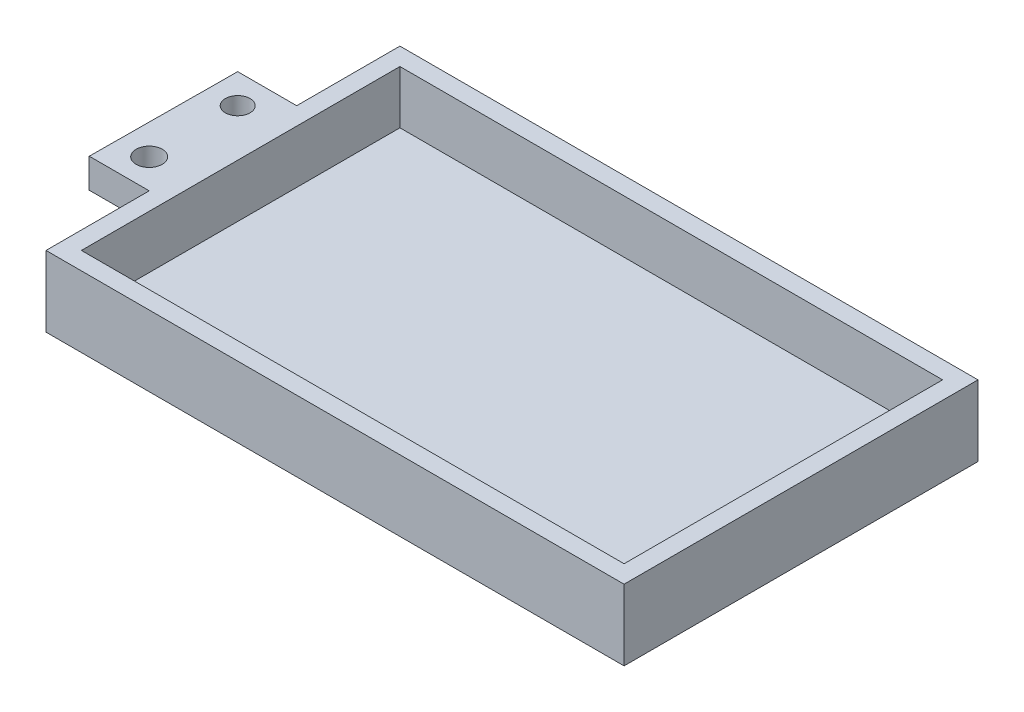
ISO-10303-21;
HEADER;
FILE_DESCRIPTION(('STEP AP214'),'2;1');
FILE_NAME('part.step','',(''),(''),'','','');
FILE_SCHEMA(('AUTOMOTIVE_DESIGN { 1 0 10303 214 1 1 1 1 }'));
ENDSEC;
DATA;
#1=APPLICATION_CONTEXT('core data for automotive mechanical design processes');
#2=APPLICATION_PROTOCOL_DEFINITION('international standard','automotive_design',2000,#1);
#3=PRODUCT_CONTEXT('',#1,'mechanical');
#4=PRODUCT('Part','Part','',(#3));
#5=PRODUCT_RELATED_PRODUCT_CATEGORY('part','',(#4));
#6=PRODUCT_DEFINITION_FORMATION('','',#4);
#7=PRODUCT_DEFINITION_CONTEXT('part definition',#1,'design');
#8=PRODUCT_DEFINITION('design','',#6,#7);
#9=PRODUCT_DEFINITION_SHAPE('','',#8);
#10=(LENGTH_UNIT() NAMED_UNIT(*) SI_UNIT(.MILLI.,.METRE.));
#11=(NAMED_UNIT(*) PLANE_ANGLE_UNIT() SI_UNIT($,.RADIAN.));
#12=(NAMED_UNIT(*) SI_UNIT($,.STERADIAN.) SOLID_ANGLE_UNIT());
#13=UNCERTAINTY_MEASURE_WITH_UNIT(LENGTH_MEASURE(1.E-05),#10,'distance_accuracy_value','');
#14=(GEOMETRIC_REPRESENTATION_CONTEXT(3) GLOBAL_UNCERTAINTY_ASSIGNED_CONTEXT((#13)) GLOBAL_UNIT_ASSIGNED_CONTEXT((#10,
#11,#12)) REPRESENTATION_CONTEXT('',''));
#15=CARTESIAN_POINT('',(0.,0.,0.));
#16=DIRECTION('',(0.,0.,1.));
#17=DIRECTION('',(1.,0.,0.));
#18=AXIS2_PLACEMENT_3D('',#15,#16,#17);
#19=CARTESIAN_POINT('',(-59.,12.,-12.5));
#20=DIRECTION('',(0.,0.,1.));
#21=DIRECTION('',(1.,0.,0.));
#22=AXIS2_PLACEMENT_3D('',#19,#20,#21);
#23=PLANE('',#22);
#24=DIRECTION('',(1.,0.,0.));
#25=VECTOR('',#24,1.);
#26=CARTESIAN_POINT('',(-59.1680789894156,7.,-12.5));
#27=LINE('',#26,#25);
#28=CARTESIAN_POINT('',(-59.,7.,-12.5));
#29=VERTEX_POINT('',#28);
#30=CARTESIAN_POINT('',(-49.,7.,-12.5));
#31=VERTEX_POINT('',#30);
#32=EDGE_CURVE('E173',#29,#31,#27,.T.);
#33=ORIENTED_EDGE('',*,*,#32,.F.);
#34=DIRECTION('',(0.,-1.,0.));
#35=VECTOR('',#34,1.);
#36=CARTESIAN_POINT('',(-59.,12.,-12.5));
#37=LINE('',#36,#35);
#38=CARTESIAN_POINT('',(-59.,12.,-12.5));
#39=VERTEX_POINT('',#38);
#40=EDGE_CURVE('E295',#39,#29,#37,.T.);
#41=ORIENTED_EDGE('',*,*,#40,.F.);
#42=DIRECTION('',(-1.,0.,0.));
#43=VECTOR('',#42,1.);
#44=CARTESIAN_POINT('',(-59.,12.,-12.5));
#45=LINE('',#44,#43);
#46=CARTESIAN_POINT('',(-49.,12.,-12.5));
#47=VERTEX_POINT('',#46);
#48=EDGE_CURVE('E253',#47,#39,#45,.T.);
#49=ORIENTED_EDGE('',*,*,#48,.F.);
#50=DIRECTION('',(0.,-1.,0.));
#51=VECTOR('',#50,1.);
#52=CARTESIAN_POINT('',(-49.,12.,-12.5));
#53=LINE('',#52,#51);
#54=EDGE_CURVE('E299',#47,#31,#53,.T.);
#55=ORIENTED_EDGE('',*,*,#54,.T.);
#56=EDGE_LOOP('',(#33,#41,#49,#55));
#57=FACE_BOUND('',#56,.T.);
#58=ADVANCED_FACE('F41',(#57),#23,.F.);
#59=CARTESIAN_POINT('',(-59.1680789894156,12.,12.5));
#60=DIRECTION('',(0.999977400328794,0.,0.00672300763542645));
#61=DIRECTION('',(0.00672300763542645,0.,-0.999977400328795));
#62=AXIS2_PLACEMENT_3D('',#59,#60,#61);
#63=PLANE('',#62);
#64=DIRECTION('',(0.,-1.,0.));
#65=VECTOR('',#64,1.);
#66=CARTESIAN_POINT('',(-59.1680789894156,12.,12.5));
#67=LINE('',#66,#65);
#68=CARTESIAN_POINT('',(-59.1680789894156,12.,12.5));
#69=VERTEX_POINT('',#68);
#70=CARTESIAN_POINT('',(-59.1680789894156,7.,12.5));
#71=VERTEX_POINT('',#70);
#72=EDGE_CURVE('E291',#69,#71,#67,.T.);
#73=ORIENTED_EDGE('',*,*,#72,.F.);
#74=DIRECTION('',(-0.00672300763542645,0.,0.999977400328794));
#75=VECTOR('',#74,1.);
#76=CARTESIAN_POINT('',(-59.1680789894156,12.,12.5));
#77=LINE('',#76,#75);
#78=EDGE_CURVE('E256',#39,#69,#77,.T.);
#79=ORIENTED_EDGE('',*,*,#78,.F.);
#80=ORIENTED_EDGE('',*,*,#40,.T.);
#81=DIRECTION('',(0.00672300763542645,0.,-0.999977400328795));
#82=VECTOR('',#81,1.);
#83=CARTESIAN_POINT('',(-59.1680789894156,7.,12.5));
#84=LINE('',#83,#82);
#85=EDGE_CURVE('E192',#71,#29,#84,.T.);
#86=ORIENTED_EDGE('',*,*,#85,.F.);
#87=EDGE_LOOP('',(#73,#79,#80,#86));
#88=FACE_BOUND('',#87,.T.);
#89=ADVANCED_FACE('F338',(#88),#63,.F.);
#90=CARTESIAN_POINT('',(-49.,12.,12.5));
#91=DIRECTION('',(0.,0.,-1.));
#92=DIRECTION('',(-1.,0.,0.));
#93=AXIS2_PLACEMENT_3D('',#90,#91,#92);
#94=PLANE('',#93);
#95=DIRECTION('',(-1.,0.,0.));
#96=VECTOR('',#95,1.);
#97=CARTESIAN_POINT('',(-59.1680789894156,7.,12.5));
#98=LINE('',#97,#96);
#99=CARTESIAN_POINT('',(-49.,7.,12.5));
#100=VERTEX_POINT('',#99);
#101=EDGE_CURVE('E184',#100,#71,#98,.T.);
#102=ORIENTED_EDGE('',*,*,#101,.F.);
#103=DIRECTION('',(0.,-1.,0.));
#104=VECTOR('',#103,1.);
#105=CARTESIAN_POINT('',(-49.,12.,12.5));
#106=LINE('',#105,#104);
#107=CARTESIAN_POINT('',(-49.,12.,12.5));
#108=VERTEX_POINT('',#107);
#109=EDGE_CURVE('E287',#108,#100,#106,.T.);
#110=ORIENTED_EDGE('',*,*,#109,.F.);
#111=DIRECTION('',(1.,0.,0.));
#112=VECTOR('',#111,1.);
#113=CARTESIAN_POINT('',(-49.,12.,12.5));
#114=LINE('',#113,#112);
#115=EDGE_CURVE('E259',#69,#108,#114,.T.);
#116=ORIENTED_EDGE('',*,*,#115,.F.);
#117=ORIENTED_EDGE('',*,*,#72,.T.);
#118=EDGE_LOOP('',(#102,#110,#116,#117));
#119=FACE_BOUND('',#118,.T.);
#120=ADVANCED_FACE('F324',(#119),#94,.F.);
#121=CARTESIAN_POINT('',(-54.,12.,-7.5));
#122=DIRECTION('',(0.,-1.,0.));
#123=DIRECTION('',(0.,0.,-1.));
#124=AXIS2_PLACEMENT_3D('',#121,#122,#123);
#125=CYLINDRICAL_SURFACE('',#124,2.1);
#126=CARTESIAN_POINT('',(-54.,12.,-7.5));
#127=DIRECTION('',(0.,1.,0.));
#128=DIRECTION('',(0.,0.,1.));
#129=AXIS2_PLACEMENT_3D('',#126,#127,#128);
#130=CIRCLE('',#129,2.1);
#131=CARTESIAN_POINT('',(-54.,12.,-5.4));
#132=VERTEX_POINT('',#131);
#133=EDGE_CURVE('E238',#132,#132,#130,.T.);
#134=ORIENTED_EDGE('',*,*,#133,.T.);
#135=EDGE_LOOP('',(#134));
#136=FACE_BOUND('',#135,.T.);
#137=CARTESIAN_POINT('',(-54.,7.,-7.5));
#138=DIRECTION('',(0.,-1.,0.));
#139=DIRECTION('',(0.,0.,-1.));
#140=AXIS2_PLACEMENT_3D('',#137,#138,#139);
#141=CIRCLE('',#140,2.1);
#142=CARTESIAN_POINT('',(-54.,7.,-9.6));
#143=VERTEX_POINT('',#142);
#144=EDGE_CURVE('E188',#143,#143,#141,.T.);
#145=ORIENTED_EDGE('',*,*,#144,.T.);
#146=EDGE_LOOP('',(#145));
#147=FACE_BOUND('',#146,.T.);
#148=ADVANCED_FACE('F374',(#136,#147),#125,.F.);
#149=CARTESIAN_POINT('',(-54.,12.,7.5));
#150=DIRECTION('',(0.,-1.,0.));
#151=DIRECTION('',(0.,0.,-1.));
#152=AXIS2_PLACEMENT_3D('',#149,#150,#151);
#153=CYLINDRICAL_SURFACE('',#152,2.22009253856752);
#154=CARTESIAN_POINT('',(-54.,12.,7.5));
#155=DIRECTION('',(0.,1.,0.));
#156=DIRECTION('',(0.,0.,1.));
#157=AXIS2_PLACEMENT_3D('',#154,#155,#156);
#158=CIRCLE('',#157,2.22009253856752);
#159=CARTESIAN_POINT('',(-54.,12.,9.72009253856753));
#160=VERTEX_POINT('',#159);
#161=EDGE_CURVE('E234',#160,#160,#158,.T.);
#162=ORIENTED_EDGE('',*,*,#161,.T.);
#163=EDGE_LOOP('',(#162));
#164=FACE_BOUND('',#163,.T.);
#165=CARTESIAN_POINT('',(-54.,7.,7.5));
#166=DIRECTION('',(0.,-1.,0.));
#167=DIRECTION('',(0.,0.,-1.));
#168=AXIS2_PLACEMENT_3D('',#165,#166,#167);
#169=CIRCLE('',#168,2.22009253856752);
#170=CARTESIAN_POINT('',(-54.,7.,5.27990746143248));
#171=VERTEX_POINT('',#170);
#172=EDGE_CURVE('E187',#171,#171,#169,.T.);
#173=ORIENTED_EDGE('',*,*,#172,.T.);
#174=EDGE_LOOP('',(#173));
#175=FACE_BOUND('',#174,.T.);
#176=ADVANCED_FACE('F382',(#164,#175),#153,.F.);
#177=CARTESIAN_POINT('',(0.,12.,0.));
#178=DIRECTION('',(0.,-1.,0.));
#179=DIRECTION('',(0.,0.,-1.));
#180=AXIS2_PLACEMENT_3D('',#177,#178,#179);
#181=PLANE('',#180);
#182=DIRECTION('',(-1.,0.,0.));
#183=VECTOR('',#182,1.);
#184=CARTESIAN_POINT('',(-46.,12.,-27.));
#185=LINE('',#184,#183);
#186=CARTESIAN_POINT('',(46.,12.,-27.));
#187=VERTEX_POINT('',#186);
#188=CARTESIAN_POINT('',(-46.,12.,-27.));
#189=VERTEX_POINT('',#188);
#190=EDGE_CURVE('E202',#187,#189,#185,.T.);
#191=ORIENTED_EDGE('',*,*,#190,.F.);
#192=DIRECTION('',(0.,0.,-1.));
#193=VECTOR('',#192,1.);
#194=CARTESIAN_POINT('',(46.,12.,-27.));
#195=LINE('',#194,#193);
#196=CARTESIAN_POINT('',(46.,12.,27.));
#197=VERTEX_POINT('',#196);
#198=EDGE_CURVE('E195',#197,#187,#195,.T.);
#199=ORIENTED_EDGE('',*,*,#198,.F.);
#200=DIRECTION('',(1.,0.,0.));
#201=VECTOR('',#200,1.);
#202=CARTESIAN_POINT('',(-46.,12.,27.));
#203=LINE('',#202,#201);
#204=CARTESIAN_POINT('',(-46.,12.,27.));
#205=VERTEX_POINT('',#204);
#206=EDGE_CURVE('E65',#205,#197,#203,.T.);
#207=ORIENTED_EDGE('',*,*,#206,.F.);
#208=DIRECTION('',(0.,0.,1.));
#209=VECTOR('',#208,1.);
#210=CARTESIAN_POINT('',(-46.,12.,-27.));
#211=LINE('',#210,#209);
#212=EDGE_CURVE('E199',#189,#205,#211,.T.);
#213=ORIENTED_EDGE('',*,*,#212,.F.);
#214=EDGE_LOOP('',(#191,#199,#207,#213));
#215=FACE_BOUND('',#214,.T.);
#216=DIRECTION('',(0.,0.,-1.));
#217=VECTOR('',#216,1.);
#218=CARTESIAN_POINT('',(49.,12.,-30.));
#219=LINE('',#218,#217);
#220=CARTESIAN_POINT('',(49.,12.,30.));
#221=VERTEX_POINT('',#220);
#222=CARTESIAN_POINT('',(49.,12.,-30.));
#223=VERTEX_POINT('',#222);
#224=EDGE_CURVE('E243',#221,#223,#219,.T.);
#225=ORIENTED_EDGE('',*,*,#224,.T.);
#226=DIRECTION('',(-1.,0.,0.));
#227=VECTOR('',#226,1.);
#228=CARTESIAN_POINT('',(-49.,12.,-30.));
#229=LINE('',#228,#227);
#230=CARTESIAN_POINT('',(-49.,12.,-30.));
#231=VERTEX_POINT('',#230);
#232=EDGE_CURVE('E246',#223,#231,#229,.T.);
#233=ORIENTED_EDGE('',*,*,#232,.T.);
#234=DIRECTION('',(0.,0.,1.));
#235=VECTOR('',#234,1.);
#236=CARTESIAN_POINT('',(-49.,12.,-12.5));
#237=LINE('',#236,#235);
#238=EDGE_CURVE('E250',#231,#47,#237,.T.);
#239=ORIENTED_EDGE('',*,*,#238,.T.);
#240=ORIENTED_EDGE('',*,*,#48,.T.);
#241=ORIENTED_EDGE('',*,*,#78,.T.);
#242=ORIENTED_EDGE('',*,*,#115,.T.);
#243=DIRECTION('',(0.,0.,1.));
#244=VECTOR('',#243,1.);
#245=CARTESIAN_POINT('',(-49.,12.,30.));
#246=LINE('',#245,#244);
#247=CARTESIAN_POINT('',(-49.,12.,30.));
#248=VERTEX_POINT('',#247);
#249=EDGE_CURVE('E262',#108,#248,#246,.T.);
#250=ORIENTED_EDGE('',*,*,#249,.T.);
#251=DIRECTION('',(1.,0.,0.));
#252=VECTOR('',#251,1.);
#253=CARTESIAN_POINT('',(49.,12.,30.));
#254=LINE('',#253,#252);
#255=EDGE_CURVE('E265',#248,#221,#254,.T.);
#256=ORIENTED_EDGE('',*,*,#255,.T.);
#257=EDGE_LOOP('',(#225,#233,#239,#240,#241,#242,#250,#256));
#258=FACE_BOUND('',#257,.T.);
#259=ORIENTED_EDGE('',*,*,#161,.F.);
#260=EDGE_LOOP('',(#259));
#261=FACE_BOUND('',#260,.T.);
#262=ORIENTED_EDGE('',*,*,#133,.F.);
#263=EDGE_LOOP('',(#262));
#264=FACE_BOUND('',#263,.T.);
#265=ADVANCED_FACE('F331',(#215,#258,#261,#264),#181,.F.);
#266=CARTESIAN_POINT('',(0.,0.,0.));
#267=DIRECTION('',(0.,-1.,0.));
#268=DIRECTION('',(0.,0.,-1.));
#269=AXIS2_PLACEMENT_3D('',#266,#267,#268);
#270=PLANE('',#269);
#271=DIRECTION('',(-1.,0.,0.));
#272=VECTOR('',#271,1.);
#273=CARTESIAN_POINT('',(-49.,0.,-30.));
#274=LINE('',#273,#272);
#275=CARTESIAN_POINT('',(49.,0.,-30.));
#276=VERTEX_POINT('',#275);
#277=CARTESIAN_POINT('',(-49.,0.,-30.));
#278=VERTEX_POINT('',#277);
#279=EDGE_CURVE('E271',#276,#278,#274,.T.);
#280=ORIENTED_EDGE('',*,*,#279,.F.);
#281=DIRECTION('',(0.,0.,-1.));
#282=VECTOR('',#281,1.);
#283=CARTESIAN_POINT('',(49.,0.,-30.));
#284=LINE('',#283,#282);
#285=CARTESIAN_POINT('',(49.,0.,30.));
#286=VERTEX_POINT('',#285);
#287=EDGE_CURVE('E242',#286,#276,#284,.T.);
#288=ORIENTED_EDGE('',*,*,#287,.F.);
#289=DIRECTION('',(1.,0.,0.));
#290=VECTOR('',#289,1.);
#291=CARTESIAN_POINT('',(49.,0.,30.));
#292=LINE('',#291,#290);
#293=CARTESIAN_POINT('',(-49.,0.,30.));
#294=VERTEX_POINT('',#293);
#295=EDGE_CURVE('E247',#294,#286,#292,.T.);
#296=ORIENTED_EDGE('',*,*,#295,.F.);
#297=DIRECTION('',(0.,0.,1.));
#298=VECTOR('',#297,1.);
#299=CARTESIAN_POINT('',(-49.,0.,30.));
#300=LINE('',#299,#298);
#301=EDGE_CURVE('E275',#278,#294,#300,.T.);
#302=ORIENTED_EDGE('',*,*,#301,.F.);
#303=EDGE_LOOP('',(#280,#288,#296,#302));
#304=FACE_BOUND('',#303,.T.);
#305=ADVANCED_FACE('F352',(#304),#270,.T.);
#306=CARTESIAN_POINT('',(49.,12.,-30.));
#307=DIRECTION('',(-1.,0.,0.));
#308=DIRECTION('',(0.,0.,1.));
#309=AXIS2_PLACEMENT_3D('',#306,#307,#308);
#310=PLANE('',#309);
#311=ORIENTED_EDGE('',*,*,#287,.T.);
#312=DIRECTION('',(0.,-1.,0.));
#313=VECTOR('',#312,1.);
#314=CARTESIAN_POINT('',(49.,12.,-30.));
#315=LINE('',#314,#313);
#316=EDGE_CURVE('E307',#223,#276,#315,.T.);
#317=ORIENTED_EDGE('',*,*,#316,.F.);
#318=ORIENTED_EDGE('',*,*,#224,.F.);
#319=DIRECTION('',(0.,-1.,0.));
#320=VECTOR('',#319,1.);
#321=CARTESIAN_POINT('',(49.,12.,30.));
#322=LINE('',#321,#320);
#323=EDGE_CURVE('E268',#221,#286,#322,.T.);
#324=ORIENTED_EDGE('',*,*,#323,.T.);
#325=EDGE_LOOP('',(#311,#317,#318,#324));
#326=FACE_BOUND('',#325,.T.);
#327=ADVANCED_FACE('F43',(#326),#310,.F.);
#328=CARTESIAN_POINT('',(-49.,12.,-30.));
#329=DIRECTION('',(0.,0.,1.));
#330=DIRECTION('',(1.,0.,0.));
#331=AXIS2_PLACEMENT_3D('',#328,#329,#330);
#332=PLANE('',#331);
#333=ORIENTED_EDGE('',*,*,#279,.T.);
#334=DIRECTION('',(0.,-1.,0.));
#335=VECTOR('',#334,1.);
#336=CARTESIAN_POINT('',(-49.,12.,-30.));
#337=LINE('',#336,#335);
#338=EDGE_CURVE('E303',#231,#278,#337,.T.);
#339=ORIENTED_EDGE('',*,*,#338,.F.);
#340=ORIENTED_EDGE('',*,*,#232,.F.);
#341=ORIENTED_EDGE('',*,*,#316,.T.);
#342=EDGE_LOOP('',(#333,#339,#340,#341));
#343=FACE_BOUND('',#342,.T.);
#344=ADVANCED_FACE('F348',(#343),#332,.F.);
#345=CARTESIAN_POINT('',(-49.,12.,30.));
#346=DIRECTION('',(1.,0.,0.));
#347=DIRECTION('',(0.,0.,-1.));
#348=AXIS2_PLACEMENT_3D('',#345,#346,#347);
#349=PLANE('',#348);
#350=DIRECTION('',(0.,0.,1.));
#351=VECTOR('',#350,1.);
#352=CARTESIAN_POINT('',(-49.,7.,12.5));
#353=LINE('',#352,#351);
#354=CARTESIAN_POINT('',(-49.,7.,2.5));
#355=VERTEX_POINT('',#354);
#356=EDGE_CURVE('E177',#355,#100,#353,.T.);
#357=ORIENTED_EDGE('',*,*,#356,.F.);
#358=DIRECTION('',(0.,-1.,0.));
#359=VECTOR('',#358,1.);
#360=CARTESIAN_POINT('',(-49.,12.,2.5));
#361=LINE('',#360,#359);
#362=CARTESIAN_POINT('',(-49.,1.83605988113944,2.5));
#363=VERTEX_POINT('',#362);
#364=EDGE_CURVE('E157',#355,#363,#361,.T.);
#365=ORIENTED_EDGE('',*,*,#364,.T.);
#366=DIRECTION('',(0.,0.,-1.));
#367=VECTOR('',#366,1.);
#368=CARTESIAN_POINT('',(-49.,1.83605988113944,30.));
#369=LINE('',#368,#367);
#370=CARTESIAN_POINT('',(-49.,1.83605988113944,-2.5));
#371=VERTEX_POINT('',#370);
#372=EDGE_CURVE('E163',#363,#371,#369,.T.);
#373=ORIENTED_EDGE('',*,*,#372,.T.);
#374=DIRECTION('',(0.,-1.,0.));
#375=VECTOR('',#374,1.);
#376=CARTESIAN_POINT('',(-49.,12.,-2.5));
#377=LINE('',#376,#375);
#378=CARTESIAN_POINT('',(-49.,7.,-2.5));
#379=VERTEX_POINT('',#378);
#380=EDGE_CURVE('E148',#379,#371,#377,.T.);
#381=ORIENTED_EDGE('',*,*,#380,.F.);
#382=EDGE_CURVE('E181',#31,#379,#353,.T.);
#383=ORIENTED_EDGE('',*,*,#382,.F.);
#384=ORIENTED_EDGE('',*,*,#54,.F.);
#385=ORIENTED_EDGE('',*,*,#238,.F.);
#386=ORIENTED_EDGE('',*,*,#338,.T.);
#387=ORIENTED_EDGE('',*,*,#301,.T.);
#388=DIRECTION('',(0.,-1.,0.));
#389=VECTOR('',#388,1.);
#390=CARTESIAN_POINT('',(-49.,12.,30.));
#391=LINE('',#390,#389);
#392=EDGE_CURVE('E283',#248,#294,#391,.T.);
#393=ORIENTED_EDGE('',*,*,#392,.F.);
#394=ORIENTED_EDGE('',*,*,#249,.F.);
#395=ORIENTED_EDGE('',*,*,#109,.T.);
#396=EDGE_LOOP('',(#357,#365,#373,#381,#383,#384,#385,#386,#387,#393,#394,#395));
#397=FACE_BOUND('',#396,.T.);
#398=ADVANCED_FACE('F170',(#397),#349,.F.);
#399=CARTESIAN_POINT('',(49.,12.,30.));
#400=DIRECTION('',(0.,0.,-1.));
#401=DIRECTION('',(-1.,0.,0.));
#402=AXIS2_PLACEMENT_3D('',#399,#400,#401);
#403=PLANE('',#402);
#404=ORIENTED_EDGE('',*,*,#295,.T.);
#405=ORIENTED_EDGE('',*,*,#323,.F.);
#406=ORIENTED_EDGE('',*,*,#255,.F.);
#407=ORIENTED_EDGE('',*,*,#392,.T.);
#408=EDGE_LOOP('',(#404,#405,#406,#407));
#409=FACE_BOUND('',#408,.T.);
#410=ADVANCED_FACE('F355',(#409),#403,.F.);
#411=CARTESIAN_POINT('',(0.,3.,0.));
#412=DIRECTION('',(0.,-1.,0.));
#413=DIRECTION('',(0.,0.,-1.));
#414=AXIS2_PLACEMENT_3D('',#411,#412,#413);
#415=PLANE('',#414);
#416=DIRECTION('',(0.,0.,-1.));
#417=VECTOR('',#416,1.);
#418=CARTESIAN_POINT('',(46.,3.,-27.));
#419=LINE('',#418,#417);
#420=CARTESIAN_POINT('',(46.,3.,27.));
#421=VERTEX_POINT('',#420);
#422=CARTESIAN_POINT('',(46.,3.,-27.));
#423=VERTEX_POINT('',#422);
#424=EDGE_CURVE('E212',#421,#423,#419,.T.);
#425=ORIENTED_EDGE('',*,*,#424,.T.);
#426=DIRECTION('',(-1.,0.,0.));
#427=VECTOR('',#426,1.);
#428=CARTESIAN_POINT('',(-46.,3.,-27.));
#429=LINE('',#428,#427);
#430=CARTESIAN_POINT('',(-46.,3.,-27.));
#431=VERTEX_POINT('',#430);
#432=EDGE_CURVE('E198',#423,#431,#429,.T.);
#433=ORIENTED_EDGE('',*,*,#432,.T.);
#434=DIRECTION('',(0.,0.,1.));
#435=VECTOR('',#434,1.);
#436=CARTESIAN_POINT('',(-46.,3.,-27.));
#437=LINE('',#436,#435);
#438=CARTESIAN_POINT('',(-46.,3.,27.));
#439=VERTEX_POINT('',#438);
#440=EDGE_CURVE('E222',#431,#439,#437,.T.);
#441=ORIENTED_EDGE('',*,*,#440,.T.);
#442=DIRECTION('',(1.,0.,0.));
#443=VECTOR('',#442,1.);
#444=CARTESIAN_POINT('',(-46.,3.,27.));
#445=LINE('',#444,#443);
#446=EDGE_CURVE('E217',#439,#421,#445,.T.);
#447=ORIENTED_EDGE('',*,*,#446,.T.);
#448=EDGE_LOOP('',(#425,#433,#441,#447));
#449=FACE_BOUND('',#448,.T.);
#450=ADVANCED_FACE('F378',(#449),#415,.F.);
#451=CARTESIAN_POINT('',(-46.,-106.677082824757,-27.));
#452=DIRECTION('',(0.,0.,-1.));
#453=DIRECTION('',(-1.,0.,0.));
#454=AXIS2_PLACEMENT_3D('',#451,#452,#453);
#455=PLANE('',#454);
#456=DIRECTION('',(0.,1.,0.));
#457=VECTOR('',#456,1.);
#458=CARTESIAN_POINT('',(46.,-106.677082824757,-27.));
#459=LINE('',#458,#457);
#460=EDGE_CURVE('E215',#423,#187,#459,.T.);
#461=ORIENTED_EDGE('',*,*,#460,.T.);
#462=ORIENTED_EDGE('',*,*,#190,.T.);
#463=DIRECTION('',(0.,1.,0.));
#464=VECTOR('',#463,1.);
#465=CARTESIAN_POINT('',(-46.,-106.677082824757,-27.));
#466=LINE('',#465,#464);
#467=EDGE_CURVE('E211',#431,#189,#466,.T.);
#468=ORIENTED_EDGE('',*,*,#467,.F.);
#469=ORIENTED_EDGE('',*,*,#432,.F.);
#470=EDGE_LOOP('',(#461,#462,#468,#469));
#471=FACE_BOUND('',#470,.T.);
#472=ADVANCED_FACE('F392',(#471),#455,.F.);
#473=CARTESIAN_POINT('',(-46.,-106.677082824757,-27.));
#474=DIRECTION('',(-1.,0.,0.));
#475=DIRECTION('',(0.,0.,1.));
#476=AXIS2_PLACEMENT_3D('',#473,#474,#475);
#477=PLANE('',#476);
#478=DIRECTION('',(0.,1.,0.));
#479=VECTOR('',#478,1.);
#480=CARTESIAN_POINT('',(-46.,-106.677082824757,27.));
#481=LINE('',#480,#479);
#482=EDGE_CURVE('E221',#439,#205,#481,.T.);
#483=ORIENTED_EDGE('',*,*,#482,.F.);
#484=ORIENTED_EDGE('',*,*,#440,.F.);
#485=ORIENTED_EDGE('',*,*,#467,.T.);
#486=ORIENTED_EDGE('',*,*,#212,.T.);
#487=EDGE_LOOP('',(#483,#484,#485,#486));
#488=FACE_BOUND('',#487,.T.);
#489=ADVANCED_FACE('F396',(#488),#477,.F.);
#490=CARTESIAN_POINT('',(-46.,-106.677082824757,27.));
#491=DIRECTION('',(0.,0.,1.));
#492=DIRECTION('',(1.,0.,0.));
#493=AXIS2_PLACEMENT_3D('',#490,#491,#492);
#494=PLANE('',#493);
#495=ORIENTED_EDGE('',*,*,#482,.T.);
#496=ORIENTED_EDGE('',*,*,#206,.T.);
#497=DIRECTION('',(0.,1.,0.));
#498=VECTOR('',#497,1.);
#499=CARTESIAN_POINT('',(46.,-106.677082824757,27.));
#500=LINE('',#499,#498);
#501=EDGE_CURVE('E216',#421,#197,#500,.T.);
#502=ORIENTED_EDGE('',*,*,#501,.F.);
#503=ORIENTED_EDGE('',*,*,#446,.F.);
#504=EDGE_LOOP('',(#495,#496,#502,#503));
#505=FACE_BOUND('',#504,.T.);
#506=ADVANCED_FACE('F400',(#505),#494,.F.);
#507=CARTESIAN_POINT('',(46.,-106.677082824757,-27.));
#508=DIRECTION('',(1.,0.,0.));
#509=DIRECTION('',(0.,0.,-1.));
#510=AXIS2_PLACEMENT_3D('',#507,#508,#509);
#511=PLANE('',#510);
#512=ORIENTED_EDGE('',*,*,#198,.T.);
#513=ORIENTED_EDGE('',*,*,#460,.F.);
#514=ORIENTED_EDGE('',*,*,#424,.F.);
#515=ORIENTED_EDGE('',*,*,#501,.T.);
#516=EDGE_LOOP('',(#512,#513,#514,#515));
#517=FACE_BOUND('',#516,.T.);
#518=ADVANCED_FACE('F404',(#517),#511,.F.);
#519=CARTESIAN_POINT('',(0.,7.,0.));
#520=DIRECTION('',(0.,-1.,0.));
#521=DIRECTION('',(0.,0.,-1.));
#522=AXIS2_PLACEMENT_3D('',#519,#520,#521);
#523=PLANE('',#522);
#524=DIRECTION('',(-1.,0.,0.));
#525=VECTOR('',#524,1.);
#526=CARTESIAN_POINT('',(0.,7.,2.5));
#527=LINE('',#526,#525);
#528=CARTESIAN_POINT('',(-56.2200925385675,7.,2.5));
#529=VERTEX_POINT('',#528);
#530=EDGE_CURVE('E12',#355,#529,#527,.T.);
#531=ORIENTED_EDGE('',*,*,#530,.F.);
#532=ORIENTED_EDGE('',*,*,#356,.T.);
#533=ORIENTED_EDGE('',*,*,#101,.T.);
#534=ORIENTED_EDGE('',*,*,#85,.T.);
#535=ORIENTED_EDGE('',*,*,#32,.T.);
#536=ORIENTED_EDGE('',*,*,#382,.T.);
#537=DIRECTION('',(-1.,0.,0.));
#538=VECTOR('',#537,1.);
#539=CARTESIAN_POINT('',(0.,7.,-2.5));
#540=LINE('',#539,#538);
#541=CARTESIAN_POINT('',(-56.2200925385675,7.,-2.5));
#542=VERTEX_POINT('',#541);
#543=EDGE_CURVE('E151',#379,#542,#540,.T.);
#544=ORIENTED_EDGE('',*,*,#543,.T.);
#545=DIRECTION('',(0.,0.,-1.));
#546=VECTOR('',#545,1.);
#547=CARTESIAN_POINT('',(-56.2200925385675,7.,0.));
#548=LINE('',#547,#546);
#549=EDGE_CURVE('E50',#529,#542,#548,.T.);
#550=ORIENTED_EDGE('',*,*,#549,.F.);
#551=EDGE_LOOP('',(#531,#532,#533,#534,#535,#536,#544,#550));
#552=FACE_BOUND('',#551,.T.);
#553=ORIENTED_EDGE('',*,*,#172,.F.);
#554=EDGE_LOOP('',(#553));
#555=FACE_BOUND('',#554,.T.);
#556=ORIENTED_EDGE('',*,*,#144,.F.);
#557=EDGE_LOOP('',(#556));
#558=FACE_BOUND('',#557,.T.);
#559=ADVANCED_FACE('F319',(#552,#555,#558),#523,.T.);
#560=CARTESIAN_POINT('',(-56.2200925385675,7.,0.));
#561=DIRECTION('',(-0.581740197061826,-0.813374663437747,0.));
#562=DIRECTION('',(0.813374663437747,-0.581740197061826,0.));
#563=AXIS2_PLACEMENT_3D('',#560,#561,#562);
#564=PLANE('',#563);
#565=ORIENTED_EDGE('',*,*,#372,.F.);
#566=DIRECTION('',(0.813374663437747,-0.581740197061826,0.));
#567=VECTOR('',#566,1.);
#568=CARTESIAN_POINT('',(-56.2200925385675,7.,2.5));
#569=LINE('',#568,#567);
#570=EDGE_CURVE('E158',#529,#363,#569,.T.);
#571=ORIENTED_EDGE('',*,*,#570,.F.);
#572=ORIENTED_EDGE('',*,*,#549,.T.);
#573=DIRECTION('',(0.813374663437747,-0.581740197061826,0.));
#574=VECTOR('',#573,1.);
#575=CARTESIAN_POINT('',(-56.2200925385675,7.,-2.5));
#576=LINE('',#575,#574);
#577=EDGE_CURVE('E57',#542,#371,#576,.T.);
#578=ORIENTED_EDGE('',*,*,#577,.T.);
#579=EDGE_LOOP('',(#565,#571,#572,#578));
#580=FACE_BOUND('',#579,.T.);
#581=ADVANCED_FACE('F161',(#580),#564,.T.);
#582=CARTESIAN_POINT('',(-5.08403949470778,6.,2.5));
#583=DIRECTION('',(0.,0.,1.));
#584=DIRECTION('',(1.,0.,0.));
#585=AXIS2_PLACEMENT_3D('',#582,#583,#584);
#586=PLANE('',#585);
#587=ORIENTED_EDGE('',*,*,#364,.F.);
#588=ORIENTED_EDGE('',*,*,#530,.T.);
#589=ORIENTED_EDGE('',*,*,#570,.T.);
#590=EDGE_LOOP('',(#587,#588,#589));
#591=FACE_BOUND('',#590,.T.);
#592=ADVANCED_FACE('F412',(#591),#586,.T.);
#593=CARTESIAN_POINT('',(-5.08403949470778,6.,-2.5));
#594=DIRECTION('',(0.,0.,1.));
#595=DIRECTION('',(1.,0.,0.));
#596=AXIS2_PLACEMENT_3D('',#593,#594,#595);
#597=PLANE('',#596);
#598=ORIENTED_EDGE('',*,*,#543,.F.);
#599=ORIENTED_EDGE('',*,*,#380,.T.);
#600=ORIENTED_EDGE('',*,*,#577,.F.);
#601=EDGE_LOOP('',(#598,#599,#600));
#602=FACE_BOUND('',#601,.T.);
#603=ADVANCED_FACE('F149',(#602),#597,.F.);
#604=CLOSED_SHELL('',(#58,#89,#120,#148,#176,#265,#305,#327,#344,#398,#410,#450,#472,#489,#506,
#518,#559,#581,#592,#603));
#605=MANIFOLD_SOLID_BREP('B2',#604);
#606=ADVANCED_BREP_SHAPE_REPRESENTATION('',(#18,#605),#14);
#607=SHAPE_DEFINITION_REPRESENTATION(#9,#606);
ENDSEC;
END-ISO-10303-21;
